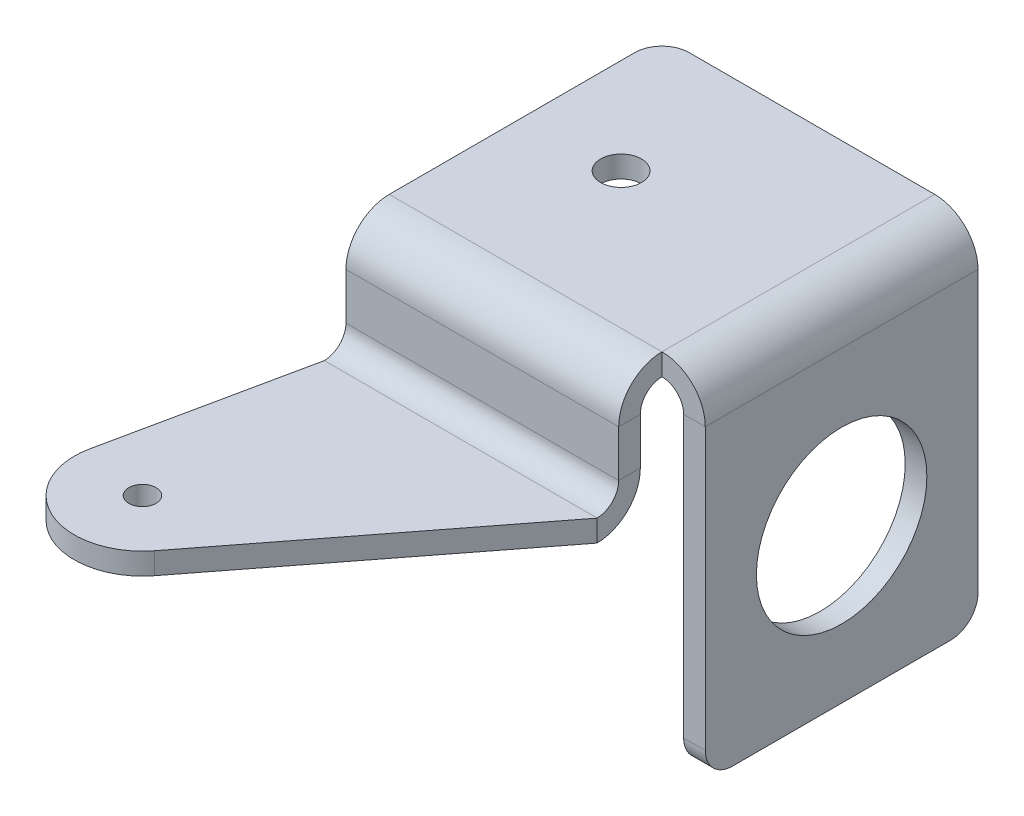
ISO-10303-21;
HEADER;
FILE_DESCRIPTION(('STEP AP214'),'2;1');
FILE_NAME('part.step','',(''),(''),'','','');
FILE_SCHEMA(('AUTOMOTIVE_DESIGN { 1 0 10303 214 1 1 1 1 }'));
ENDSEC;
DATA;
#1=APPLICATION_CONTEXT('core data for automotive mechanical design processes');
#2=APPLICATION_PROTOCOL_DEFINITION('international standard','automotive_design',2000,#1);
#3=PRODUCT_CONTEXT('',#1,'mechanical');
#4=PRODUCT('Part','Part','',(#3));
#5=PRODUCT_RELATED_PRODUCT_CATEGORY('part','',(#4));
#6=PRODUCT_DEFINITION_FORMATION('','',#4);
#7=PRODUCT_DEFINITION_CONTEXT('part definition',#1,'design');
#8=PRODUCT_DEFINITION('design','',#6,#7);
#9=PRODUCT_DEFINITION_SHAPE('','',#8);
#10=(LENGTH_UNIT() NAMED_UNIT(*) SI_UNIT(.MILLI.,.METRE.));
#11=(NAMED_UNIT(*) PLANE_ANGLE_UNIT() SI_UNIT($,.RADIAN.));
#12=(NAMED_UNIT(*) SI_UNIT($,.STERADIAN.) SOLID_ANGLE_UNIT());
#13=UNCERTAINTY_MEASURE_WITH_UNIT(LENGTH_MEASURE(1.E-05),#10,'distance_accuracy_value','');
#14=(GEOMETRIC_REPRESENTATION_CONTEXT(3) GLOBAL_UNCERTAINTY_ASSIGNED_CONTEXT((#13)) GLOBAL_UNIT_ASSIGNED_CONTEXT((#10,
#11,#12)) REPRESENTATION_CONTEXT('',''));
#15=CARTESIAN_POINT('',(0.,0.,0.));
#16=DIRECTION('',(0.,0.,1.));
#17=DIRECTION('',(1.,0.,0.));
#18=AXIS2_PLACEMENT_3D('',#15,#16,#17);
#19=CARTESIAN_POINT('',(40.,1.27,0.));
#20=DIRECTION('',(1.,0.,0.));
#21=DIRECTION('',(0.,0.,-1.));
#22=AXIS2_PLACEMENT_3D('',#19,#20,#21);
#23=PLANE('',#22);
#24=DIRECTION('',(0.,0.,-1.));
#25=VECTOR('',#24,1.);
#26=CARTESIAN_POINT('',(40.,-0.3175,0.));
#27=LINE('',#26,#25);
#28=CARTESIAN_POINT('',(40.,-0.317499999999995,0.));
#29=VERTEX_POINT('',#28);
#30=CARTESIAN_POINT('',(40.,-0.3175,-18.));
#31=VERTEX_POINT('',#30);
#32=EDGE_CURVE('E370',#29,#31,#27,.T.);
#33=ORIENTED_EDGE('',*,*,#32,.F.);
#34=DIRECTION('',(0.,1.,0.));
#35=VECTOR('',#34,1.);
#36=CARTESIAN_POINT('',(40.,1.27,0.));
#37=LINE('',#36,#35);
#38=CARTESIAN_POINT('',(40.,1.27,0.));
#39=VERTEX_POINT('',#38);
#40=EDGE_CURVE('E378',#29,#39,#37,.T.);
#41=ORIENTED_EDGE('',*,*,#40,.T.);
#42=DIRECTION('',(0.,0.,-1.));
#43=VECTOR('',#42,1.);
#44=CARTESIAN_POINT('',(40.,1.27,0.));
#45=LINE('',#44,#43);
#46=CARTESIAN_POINT('',(40.,1.27,-18.));
#47=VERTEX_POINT('',#46);
#48=EDGE_CURVE('E355',#39,#47,#45,.T.);
#49=ORIENTED_EDGE('',*,*,#48,.T.);
#50=DIRECTION('',(0.,-1.,0.));
#51=VECTOR('',#50,1.);
#52=CARTESIAN_POINT('',(40.,1.27,-18.));
#53=LINE('',#52,#51);
#54=EDGE_CURVE('E381',#31,#47,#53,.F.);
#55=ORIENTED_EDGE('',*,*,#54,.F.);
#56=EDGE_LOOP('',(#33,#41,#49,#55));
#57=FACE_BOUND('',#56,.T.);
#58=ADVANCED_FACE('F47',(#57),#23,.F.);
#59=CARTESIAN_POINT('',(60.,1.27,-20.));
#60=DIRECTION('',(0.,0.,1.));
#61=DIRECTION('',(1.,0.,0.));
#62=AXIS2_PLACEMENT_3D('',#59,#60,#61);
#63=PLANE('',#62);
#64=DIRECTION('',(1.,0.,0.));
#65=VECTOR('',#64,1.);
#66=CARTESIAN_POINT('',(60.,1.27,-20.));
#67=LINE('',#66,#65);
#68=CARTESIAN_POINT('',(42.,1.27,-20.));
#69=VERTEX_POINT('',#68);
#70=CARTESIAN_POINT('',(60.,1.27,-20.));
#71=VERTEX_POINT('',#70);
#72=EDGE_CURVE('E358',#69,#71,#67,.T.);
#73=ORIENTED_EDGE('',*,*,#72,.T.);
#74=DIRECTION('',(0.,1.,0.));
#75=VECTOR('',#74,1.);
#76=CARTESIAN_POINT('',(60.,1.27,-20.));
#77=LINE('',#76,#75);
#78=CARTESIAN_POINT('',(60.,-0.317499999999999,-20.));
#79=VERTEX_POINT('',#78);
#80=EDGE_CURVE('E375',#79,#71,#77,.T.);
#81=ORIENTED_EDGE('',*,*,#80,.F.);
#82=DIRECTION('',(-1.,0.,0.));
#83=VECTOR('',#82,1.);
#84=CARTESIAN_POINT('',(60.,-0.3175,-20.));
#85=LINE('',#84,#83);
#86=CARTESIAN_POINT('',(42.,-0.3175,-20.));
#87=VERTEX_POINT('',#86);
#88=EDGE_CURVE('E349',#87,#79,#85,.F.);
#89=ORIENTED_EDGE('',*,*,#88,.F.);
#90=DIRECTION('',(0.,-1.,0.));
#91=VECTOR('',#90,1.);
#92=CARTESIAN_POINT('',(42.,1.27,-20.));
#93=LINE('',#92,#91);
#94=EDGE_CURVE('E388',#69,#87,#93,.T.);
#95=ORIENTED_EDGE('',*,*,#94,.F.);
#96=EDGE_LOOP('',(#73,#81,#89,#95));
#97=FACE_BOUND('',#96,.T.);
#98=ADVANCED_FACE('F439',(#97),#63,.F.);
#99=CARTESIAN_POINT('',(47.,1.27,-10.));
#100=DIRECTION('',(0.,-1.,0.));
#101=DIRECTION('',(0.,0.,-1.));
#102=AXIS2_PLACEMENT_3D('',#99,#100,#101);
#103=CYLINDRICAL_SURFACE('',#102,1.5);
#104=CARTESIAN_POINT('',(47.,1.27,-10.));
#105=DIRECTION('',(0.,-1.,0.));
#106=DIRECTION('',(0.,0.,1.));
#107=AXIS2_PLACEMENT_3D('',#104,#105,#106);
#108=CIRCLE('',#107,1.5);
#109=CARTESIAN_POINT('',(47.,1.27,-8.5));
#110=VERTEX_POINT('',#109);
#111=EDGE_CURVE('E345',#110,#110,#108,.T.);
#112=ORIENTED_EDGE('',*,*,#111,.F.);
#113=EDGE_LOOP('',(#112));
#114=FACE_BOUND('',#113,.T.);
#115=CARTESIAN_POINT('',(47.,-0.3175,-10.));
#116=DIRECTION('',(0.,-1.,0.));
#117=DIRECTION('',(0.,0.,1.));
#118=AXIS2_PLACEMENT_3D('',#115,#116,#117);
#119=CIRCLE('',#118,1.5);
#120=CARTESIAN_POINT('',(47.,-0.3175,-8.5));
#121=VERTEX_POINT('',#120);
#122=EDGE_CURVE('E338',#121,#121,#119,.T.);
#123=ORIENTED_EDGE('',*,*,#122,.T.);
#124=EDGE_LOOP('',(#123));
#125=FACE_BOUND('',#124,.T.);
#126=ADVANCED_FACE('F445',(#114,#125),#103,.F.);
#127=CARTESIAN_POINT('',(60.,1.27,0.));
#128=DIRECTION('',(0.,-1.,0.));
#129=DIRECTION('',(0.,0.,-1.));
#130=AXIS2_PLACEMENT_3D('',#127,#128,#129);
#131=PLANE('',#130);
#132=ORIENTED_EDGE('',*,*,#111,.T.);
#133=EDGE_LOOP('',(#132));
#134=FACE_BOUND('',#133,.T.);
#135=ORIENTED_EDGE('',*,*,#48,.F.);
#136=DIRECTION('',(-1.,0.,0.));
#137=VECTOR('',#136,1.);
#138=CARTESIAN_POINT('',(60.,1.27,0.));
#139=LINE('',#138,#137);
#140=CARTESIAN_POINT('',(60.,1.27000000000001,0.));
#141=VERTEX_POINT('',#140);
#142=EDGE_CURVE('E352',#141,#39,#139,.T.);
#143=ORIENTED_EDGE('',*,*,#142,.F.);
#144=DIRECTION('',(0.,0.,1.));
#145=VECTOR('',#144,1.);
#146=CARTESIAN_POINT('',(60.,1.27,0.));
#147=LINE('',#146,#145);
#148=EDGE_CURVE('E348',#71,#141,#147,.T.);
#149=ORIENTED_EDGE('',*,*,#148,.F.);
#150=ORIENTED_EDGE('',*,*,#72,.F.);
#151=CARTESIAN_POINT('',(42.,1.27,-18.));
#152=DIRECTION('',(0.,1.,0.));
#153=DIRECTION('',(0.,0.,-1.));
#154=AXIS2_PLACEMENT_3D('',#151,#152,#153);
#155=CIRCLE('',#154,2.);
#156=EDGE_CURVE('E386',#47,#69,#155,.F.);
#157=ORIENTED_EDGE('',*,*,#156,.F.);
#158=EDGE_LOOP('',(#135,#143,#149,#150,#157));
#159=FACE_BOUND('',#158,.T.);
#160=ADVANCED_FACE('F477',(#134,#159),#131,.F.);
#161=CARTESIAN_POINT('',(60.,-0.3175,0.));
#162=DIRECTION('',(0.,-1.,0.));
#163=DIRECTION('',(0.,0.,-1.));
#164=AXIS2_PLACEMENT_3D('',#161,#162,#163);
#165=PLANE('',#164);
#166=ORIENTED_EDGE('',*,*,#122,.F.);
#167=EDGE_LOOP('',(#166));
#168=FACE_BOUND('',#167,.T.);
#169=ORIENTED_EDGE('',*,*,#88,.T.);
#170=DIRECTION('',(0.,0.,-1.));
#171=VECTOR('',#170,1.);
#172=CARTESIAN_POINT('',(60.,-0.3175,0.));
#173=LINE('',#172,#171);
#174=CARTESIAN_POINT('',(60.,-0.317499999999995,0.));
#175=VERTEX_POINT('',#174);
#176=EDGE_CURVE('E364',#79,#175,#173,.F.);
#177=ORIENTED_EDGE('',*,*,#176,.T.);
#178=DIRECTION('',(-1.,0.,0.));
#179=VECTOR('',#178,1.);
#180=CARTESIAN_POINT('',(60.,-0.3175,0.));
#181=LINE('',#180,#179);
#182=EDGE_CURVE('E367',#175,#29,#181,.T.);
#183=ORIENTED_EDGE('',*,*,#182,.T.);
#184=ORIENTED_EDGE('',*,*,#32,.T.);
#185=CARTESIAN_POINT('',(42.,-0.3175,-18.));
#186=DIRECTION('',(0.,1.,0.));
#187=DIRECTION('',(0.,0.,-1.));
#188=AXIS2_PLACEMENT_3D('',#185,#186,#187);
#189=CIRCLE('',#188,2.);
#190=EDGE_CURVE('E391',#87,#31,#189,.T.);
#191=ORIENTED_EDGE('',*,*,#190,.F.);
#192=EDGE_LOOP('',(#169,#177,#183,#184,#191));
#193=FACE_BOUND('',#192,.T.);
#194=ADVANCED_FACE('F463',(#168,#193),#165,.T.);
#195=CARTESIAN_POINT('',(60.,-1.905,0.));
#196=DIRECTION('',(0.,0.,1.));
#197=DIRECTION('',(-1.,0.,0.));
#198=AXIS2_PLACEMENT_3D('',#195,#196,#197);
#199=PLANE('',#198);
#200=DIRECTION('',(-1.,0.,0.));
#201=VECTOR('',#200,1.);
#202=CARTESIAN_POINT('',(63.175,-1.90499999999999,0.));
#203=LINE('',#202,#201);
#204=CARTESIAN_POINT('',(61.5875,-1.90499999999999,0.));
#205=VERTEX_POINT('',#204);
#206=CARTESIAN_POINT('',(63.175,-1.90499999999999,0.));
#207=VERTEX_POINT('',#206);
#208=EDGE_CURVE('E306',#205,#207,#203,.F.);
#209=ORIENTED_EDGE('',*,*,#208,.T.);
#210=CARTESIAN_POINT('',(60.,-1.905,0.));
#211=DIRECTION('',(0.,0.,1.));
#212=DIRECTION('',(1.,0.,0.));
#213=AXIS2_PLACEMENT_3D('',#210,#211,#212);
#214=CIRCLE('',#213,3.175);
#215=EDGE_CURVE('E335',#141,#207,#214,.F.);
#216=ORIENTED_EDGE('',*,*,#215,.F.);
#217=DIRECTION('',(0.,1.,0.));
#218=VECTOR('',#217,1.);
#219=CARTESIAN_POINT('',(60.,1.27,0.));
#220=LINE('',#219,#218);
#221=EDGE_CURVE('E361',#175,#141,#220,.T.);
#222=ORIENTED_EDGE('',*,*,#221,.F.);
#223=CARTESIAN_POINT('',(60.,-1.905,0.));
#224=DIRECTION('',(0.,0.,1.));
#225=DIRECTION('',(1.,0.,0.));
#226=AXIS2_PLACEMENT_3D('',#223,#224,#225);
#227=CIRCLE('',#226,1.5875);
#228=EDGE_CURVE('E341',#175,#205,#227,.F.);
#229=ORIENTED_EDGE('',*,*,#228,.T.);
#230=EDGE_LOOP('',(#209,#216,#222,#229));
#231=FACE_BOUND('',#230,.T.);
#232=ADVANCED_FACE('F428',(#231),#199,.T.);
#233=CARTESIAN_POINT('',(60.,-1.905,-20.));
#234=DIRECTION('',(0.,0.,1.));
#235=DIRECTION('',(-1.,0.,0.));
#236=AXIS2_PLACEMENT_3D('',#233,#234,#235);
#237=PLANE('',#236);
#238=CARTESIAN_POINT('',(60.,-1.905,-20.));
#239=DIRECTION('',(0.,0.,1.));
#240=DIRECTION('',(1.,0.,0.));
#241=AXIS2_PLACEMENT_3D('',#238,#239,#240);
#242=CIRCLE('',#241,1.5875);
#243=CARTESIAN_POINT('',(61.5875,-1.90499999999999,-20.));
#244=VERTEX_POINT('',#243);
#245=EDGE_CURVE('E309',#244,#79,#242,.T.);
#246=ORIENTED_EDGE('',*,*,#245,.T.);
#247=ORIENTED_EDGE('',*,*,#80,.T.);
#248=CARTESIAN_POINT('',(60.,-1.905,-20.));
#249=DIRECTION('',(0.,0.,1.));
#250=DIRECTION('',(1.,0.,0.));
#251=AXIS2_PLACEMENT_3D('',#248,#249,#250);
#252=CIRCLE('',#251,3.175);
#253=CARTESIAN_POINT('',(63.175,-1.90499999999999,-20.));
#254=VERTEX_POINT('',#253);
#255=EDGE_CURVE('E339',#254,#71,#252,.T.);
#256=ORIENTED_EDGE('',*,*,#255,.F.);
#257=DIRECTION('',(-1.,0.,0.));
#258=VECTOR('',#257,1.);
#259=CARTESIAN_POINT('',(61.5875,-1.90499999999999,-20.));
#260=LINE('',#259,#258);
#261=EDGE_CURVE('E327',#244,#254,#260,.F.);
#262=ORIENTED_EDGE('',*,*,#261,.F.);
#263=EDGE_LOOP('',(#246,#247,#256,#262));
#264=FACE_BOUND('',#263,.T.);
#265=ADVANCED_FACE('F481',(#264),#237,.F.);
#266=CARTESIAN_POINT('',(60.,-1.905,-20.));
#267=DIRECTION('',(0.,0.,-1.));
#268=DIRECTION('',(1.,0.,0.));
#269=AXIS2_PLACEMENT_3D('',#266,#267,#268);
#270=CYLINDRICAL_SURFACE('',#269,3.175);
#271=ORIENTED_EDGE('',*,*,#148,.T.);
#272=ORIENTED_EDGE('',*,*,#215,.T.);
#273=DIRECTION('',(0.,0.,-1.));
#274=VECTOR('',#273,1.);
#275=CARTESIAN_POINT('',(63.175,-1.90499999999999,0.));
#276=LINE('',#275,#274);
#277=EDGE_CURVE('E324',#254,#207,#276,.F.);
#278=ORIENTED_EDGE('',*,*,#277,.F.);
#279=ORIENTED_EDGE('',*,*,#255,.T.);
#280=EDGE_LOOP('',(#271,#272,#278,#279));
#281=FACE_BOUND('',#280,.T.);
#282=ADVANCED_FACE('F421',(#281),#270,.T.);
#283=CARTESIAN_POINT('',(60.,-1.905,-20.));
#284=DIRECTION('',(0.,0.,-1.));
#285=DIRECTION('',(1.,0.,0.));
#286=AXIS2_PLACEMENT_3D('',#283,#284,#285);
#287=CYLINDRICAL_SURFACE('',#286,1.5875);
#288=ORIENTED_EDGE('',*,*,#176,.F.);
#289=ORIENTED_EDGE('',*,*,#245,.F.);
#290=DIRECTION('',(0.,0.,-1.));
#291=VECTOR('',#290,1.);
#292=CARTESIAN_POINT('',(61.5875,-1.90499999999999,0.));
#293=LINE('',#292,#291);
#294=EDGE_CURVE('E330',#205,#244,#293,.T.);
#295=ORIENTED_EDGE('',*,*,#294,.F.);
#296=ORIENTED_EDGE('',*,*,#228,.F.);
#297=EDGE_LOOP('',(#288,#289,#295,#296));
#298=FACE_BOUND('',#297,.T.);
#299=ADVANCED_FACE('F485',(#298),#287,.F.);
#300=CARTESIAN_POINT('',(63.1750000000001,-24.455,-20.));
#301=DIRECTION('',(0.,0.,1.));
#302=DIRECTION('',(-1.,0.,0.));
#303=AXIS2_PLACEMENT_3D('',#300,#301,#302);
#304=PLANE('',#303);
#305=DIRECTION('',(0.,1.,0.));
#306=VECTOR('',#305,1.);
#307=CARTESIAN_POINT('',(61.5875000000001,-24.455,-20.));
#308=LINE('',#307,#306);
#309=CARTESIAN_POINT('',(61.5875000000001,-22.455,-20.));
#310=VERTEX_POINT('',#309);
#311=EDGE_CURVE('E321',#244,#310,#308,.F.);
#312=ORIENTED_EDGE('',*,*,#311,.F.);
#313=ORIENTED_EDGE('',*,*,#261,.T.);
#314=DIRECTION('',(0.,-1.,0.));
#315=VECTOR('',#314,1.);
#316=CARTESIAN_POINT('',(63.175,0.,-20.));
#317=LINE('',#316,#315);
#318=CARTESIAN_POINT('',(63.1750000000001,-22.455,-20.));
#319=VERTEX_POINT('',#318);
#320=EDGE_CURVE('E313',#254,#319,#317,.T.);
#321=ORIENTED_EDGE('',*,*,#320,.T.);
#322=DIRECTION('',(-1.,0.,0.));
#323=VECTOR('',#322,1.);
#324=CARTESIAN_POINT('',(63.1750000000001,-22.455,-20.));
#325=LINE('',#324,#323);
#326=EDGE_CURVE('E402',#310,#319,#325,.F.);
#327=ORIENTED_EDGE('',*,*,#326,.F.);
#328=EDGE_LOOP('',(#312,#313,#321,#327));
#329=FACE_BOUND('',#328,.T.);
#330=ADVANCED_FACE('F416',(#329),#304,.F.);
#331=CARTESIAN_POINT('',(63.175,-0.317499999999994,0.));
#332=DIRECTION('',(0.,0.,-1.));
#333=DIRECTION('',(1.,0.,0.));
#334=AXIS2_PLACEMENT_3D('',#331,#332,#333);
#335=PLANE('',#334);
#336=DIRECTION('',(0.,1.,0.));
#337=VECTOR('',#336,1.);
#338=CARTESIAN_POINT('',(63.175,0.,0.));
#339=LINE('',#338,#337);
#340=CARTESIAN_POINT('',(63.1750000000001,-22.455,0.));
#341=VERTEX_POINT('',#340);
#342=EDGE_CURVE('E307',#341,#207,#339,.T.);
#343=ORIENTED_EDGE('',*,*,#342,.T.);
#344=ORIENTED_EDGE('',*,*,#208,.F.);
#345=DIRECTION('',(0.,-1.,0.));
#346=VECTOR('',#345,1.);
#347=CARTESIAN_POINT('',(61.5875,-0.3175,0.));
#348=LINE('',#347,#346);
#349=CARTESIAN_POINT('',(61.5875000000001,-22.455,0.));
#350=VERTEX_POINT('',#349);
#351=EDGE_CURVE('E316',#350,#205,#348,.F.);
#352=ORIENTED_EDGE('',*,*,#351,.F.);
#353=DIRECTION('',(-1.,0.,0.));
#354=VECTOR('',#353,1.);
#355=CARTESIAN_POINT('',(63.1750000000001,-22.455,0.));
#356=LINE('',#355,#354);
#357=EDGE_CURVE('E11',#341,#350,#356,.T.);
#358=ORIENTED_EDGE('',*,*,#357,.F.);
#359=EDGE_LOOP('',(#343,#344,#352,#358));
#360=FACE_BOUND('',#359,.T.);
#361=ADVANCED_FACE('F432',(#360),#335,.F.);
#362=CARTESIAN_POINT('',(63.175,0.,0.));
#363=DIRECTION('',(-1.,0.,0.));
#364=DIRECTION('',(0.,1.,0.));
#365=AXIS2_PLACEMENT_3D('',#362,#363,#364);
#366=PLANE('',#365);
#367=CARTESIAN_POINT('',(63.175,-13.18,-10.));
#368=DIRECTION('',(1.,0.,0.));
#369=DIRECTION('',(0.,1.,0.));
#370=AXIS2_PLACEMENT_3D('',#367,#368,#369);
#371=CIRCLE('',#370,6.25);
#372=CARTESIAN_POINT('',(63.175,-6.92999999999999,-10.));
#373=VERTEX_POINT('',#372);
#374=EDGE_CURVE('E303',#373,#373,#371,.F.);
#375=ORIENTED_EDGE('',*,*,#374,.T.);
#376=EDGE_LOOP('',(#375));
#377=FACE_BOUND('',#376,.T.);
#378=ORIENTED_EDGE('',*,*,#320,.F.);
#379=ORIENTED_EDGE('',*,*,#277,.T.);
#380=ORIENTED_EDGE('',*,*,#342,.F.);
#381=CARTESIAN_POINT('',(63.1750000000001,-22.455,-2.));
#382=DIRECTION('',(1.,0.,0.));
#383=DIRECTION('',(0.,1.,0.));
#384=AXIS2_PLACEMENT_3D('',#381,#382,#383);
#385=CIRCLE('',#384,2.);
#386=CARTESIAN_POINT('',(63.1750000000001,-24.455,-2.));
#387=VERTEX_POINT('',#386);
#388=EDGE_CURVE('E61',#387,#341,#385,.F.);
#389=ORIENTED_EDGE('',*,*,#388,.F.);
#390=DIRECTION('',(0.,0.,1.));
#391=VECTOR('',#390,1.);
#392=CARTESIAN_POINT('',(63.1750000000001,-24.455,0.));
#393=LINE('',#392,#391);
#394=CARTESIAN_POINT('',(63.1750000000001,-24.455,-18.));
#395=VERTEX_POINT('',#394);
#396=EDGE_CURVE('E310',#395,#387,#393,.T.);
#397=ORIENTED_EDGE('',*,*,#396,.F.);
#398=CARTESIAN_POINT('',(63.1750000000001,-22.455,-18.));
#399=DIRECTION('',(1.,0.,0.));
#400=DIRECTION('',(0.,1.,0.));
#401=AXIS2_PLACEMENT_3D('',#398,#399,#400);
#402=CIRCLE('',#401,2.);
#403=EDGE_CURVE('E55',#319,#395,#402,.F.);
#404=ORIENTED_EDGE('',*,*,#403,.F.);
#405=EDGE_LOOP('',(#378,#379,#380,#389,#397,#404));
#406=FACE_BOUND('',#405,.T.);
#407=ADVANCED_FACE('F408',(#377,#406),#366,.F.);
#408=CARTESIAN_POINT('',(61.5875,0.,0.));
#409=DIRECTION('',(-1.,0.,0.));
#410=DIRECTION('',(0.,1.,0.));
#411=AXIS2_PLACEMENT_3D('',#408,#409,#410);
#412=PLANE('',#411);
#413=CARTESIAN_POINT('',(61.5875,-13.18,-10.));
#414=DIRECTION('',(1.,0.,0.));
#415=DIRECTION('',(0.,1.,0.));
#416=AXIS2_PLACEMENT_3D('',#413,#414,#415);
#417=CIRCLE('',#416,6.25);
#418=CARTESIAN_POINT('',(61.5875,-6.93,-10.));
#419=VERTEX_POINT('',#418);
#420=EDGE_CURVE('E294',#419,#419,#417,.T.);
#421=ORIENTED_EDGE('',*,*,#420,.T.);
#422=EDGE_LOOP('',(#421));
#423=FACE_BOUND('',#422,.T.);
#424=DIRECTION('',(0.,0.,-1.));
#425=VECTOR('',#424,1.);
#426=CARTESIAN_POINT('',(61.5875000000001,-24.455,0.));
#427=LINE('',#426,#425);
#428=CARTESIAN_POINT('',(61.5875000000001,-24.455,-18.));
#429=VERTEX_POINT('',#428);
#430=CARTESIAN_POINT('',(61.5875000000001,-24.455,-2.));
#431=VERTEX_POINT('',#430);
#432=EDGE_CURVE('E318',#429,#431,#427,.F.);
#433=ORIENTED_EDGE('',*,*,#432,.T.);
#434=CARTESIAN_POINT('',(61.5875000000001,-22.455,-2.));
#435=DIRECTION('',(1.,0.,0.));
#436=DIRECTION('',(0.,1.,0.));
#437=AXIS2_PLACEMENT_3D('',#434,#435,#436);
#438=CIRCLE('',#437,2.);
#439=EDGE_CURVE('E397',#350,#431,#438,.T.);
#440=ORIENTED_EDGE('',*,*,#439,.F.);
#441=ORIENTED_EDGE('',*,*,#351,.T.);
#442=ORIENTED_EDGE('',*,*,#294,.T.);
#443=ORIENTED_EDGE('',*,*,#311,.T.);
#444=CARTESIAN_POINT('',(61.5875000000001,-22.455,-18.));
#445=DIRECTION('',(1.,0.,0.));
#446=DIRECTION('',(0.,1.,0.));
#447=AXIS2_PLACEMENT_3D('',#444,#445,#446);
#448=CIRCLE('',#447,2.);
#449=EDGE_CURVE('E400',#429,#310,#448,.T.);
#450=ORIENTED_EDGE('',*,*,#449,.F.);
#451=EDGE_LOOP('',(#433,#440,#441,#442,#443,#450));
#452=FACE_BOUND('',#451,.T.);
#453=ADVANCED_FACE('F414',(#423,#452),#412,.T.);
#454=CARTESIAN_POINT('',(63.1750000000001,-24.455,0.));
#455=DIRECTION('',(0.,1.,0.));
#456=DIRECTION('',(1.,0.,0.));
#457=AXIS2_PLACEMENT_3D('',#454,#455,#456);
#458=PLANE('',#457);
#459=ORIENTED_EDGE('',*,*,#396,.T.);
#460=DIRECTION('',(-1.,0.,0.));
#461=VECTOR('',#460,1.);
#462=CARTESIAN_POINT('',(63.1750000000001,-24.455,-2.));
#463=LINE('',#462,#461);
#464=EDGE_CURVE('E393',#431,#387,#463,.F.);
#465=ORIENTED_EDGE('',*,*,#464,.F.);
#466=ORIENTED_EDGE('',*,*,#432,.F.);
#467=DIRECTION('',(-1.,0.,0.));
#468=VECTOR('',#467,1.);
#469=CARTESIAN_POINT('',(63.1750000000001,-24.455,-18.));
#470=LINE('',#469,#468);
#471=EDGE_CURVE('E395',#395,#429,#470,.T.);
#472=ORIENTED_EDGE('',*,*,#471,.F.);
#473=EDGE_LOOP('',(#459,#465,#466,#472));
#474=FACE_BOUND('',#473,.T.);
#475=ADVANCED_FACE('F411',(#474),#458,.F.);
#476=CARTESIAN_POINT('',(63.1760000000001,-13.18,-10.));
#477=DIRECTION('',(-1.,0.,0.));
#478=DIRECTION('',(0.,1.,0.));
#479=AXIS2_PLACEMENT_3D('',#476,#477,#478);
#480=CYLINDRICAL_SURFACE('',#479,6.25);
#481=ORIENTED_EDGE('',*,*,#420,.F.);
#482=EDGE_LOOP('',(#481));
#483=FACE_BOUND('',#482,.T.);
#484=ORIENTED_EDGE('',*,*,#374,.F.);
#485=EDGE_LOOP('',(#484));
#486=FACE_BOUND('',#485,.T.);
#487=ADVANCED_FACE('F582',(#483,#486),#480,.F.);
#488=CARTESIAN_POINT('',(40.,-1.90499999999999,0.));
#489=DIRECTION('',(-1.,0.,0.));
#490=DIRECTION('',(0.,0.,-1.));
#491=AXIS2_PLACEMENT_3D('',#488,#489,#490);
#492=PLANE('',#491);
#493=DIRECTION('',(0.,0.,-1.));
#494=VECTOR('',#493,1.);
#495=CARTESIAN_POINT('',(40.,-1.90499999999999,3.17499999999999));
#496=LINE('',#495,#494);
#497=CARTESIAN_POINT('',(40.,-1.90499999999999,1.5875));
#498=VERTEX_POINT('',#497);
#499=CARTESIAN_POINT('',(40.,-1.90499999999998,3.175));
#500=VERTEX_POINT('',#499);
#501=EDGE_CURVE('E250',#498,#500,#496,.F.);
#502=ORIENTED_EDGE('',*,*,#501,.T.);
#503=CARTESIAN_POINT('',(40.,-1.90499999999999,0.));
#504=DIRECTION('',(-1.,0.,0.));
#505=DIRECTION('',(0.,0.,1.));
#506=AXIS2_PLACEMENT_3D('',#503,#504,#505);
#507=CIRCLE('',#506,3.175);
#508=EDGE_CURVE('E291',#39,#500,#507,.F.);
#509=ORIENTED_EDGE('',*,*,#508,.F.);
#510=ORIENTED_EDGE('',*,*,#40,.F.);
#511=CARTESIAN_POINT('',(40.,-1.90499999999999,0.));
#512=DIRECTION('',(-1.,0.,0.));
#513=DIRECTION('',(0.,0.,1.));
#514=AXIS2_PLACEMENT_3D('',#511,#512,#513);
#515=CIRCLE('',#514,1.5875);
#516=EDGE_CURVE('E297',#29,#498,#515,.F.);
#517=ORIENTED_EDGE('',*,*,#516,.T.);
#518=EDGE_LOOP('',(#502,#509,#510,#517));
#519=FACE_BOUND('',#518,.T.);
#520=ADVANCED_FACE('F470',(#519),#492,.T.);
#521=CARTESIAN_POINT('',(60.,-1.90499999999999,0.));
#522=DIRECTION('',(-1.,0.,0.));
#523=DIRECTION('',(0.,0.,-1.));
#524=AXIS2_PLACEMENT_3D('',#521,#522,#523);
#525=PLANE('',#524);
#526=CARTESIAN_POINT('',(60.,-1.90499999999999,0.));
#527=DIRECTION('',(-1.,0.,0.));
#528=DIRECTION('',(0.,0.,1.));
#529=AXIS2_PLACEMENT_3D('',#526,#527,#528);
#530=CIRCLE('',#529,1.5875);
#531=CARTESIAN_POINT('',(60.,-1.90499999999999,1.5875));
#532=VERTEX_POINT('',#531);
#533=EDGE_CURVE('E260',#532,#175,#530,.T.);
#534=ORIENTED_EDGE('',*,*,#533,.T.);
#535=ORIENTED_EDGE('',*,*,#221,.T.);
#536=CARTESIAN_POINT('',(60.,-1.90499999999999,0.));
#537=DIRECTION('',(-1.,0.,0.));
#538=DIRECTION('',(0.,0.,1.));
#539=AXIS2_PLACEMENT_3D('',#536,#537,#538);
#540=CIRCLE('',#539,3.175);
#541=CARTESIAN_POINT('',(60.,-1.90499999999999,3.175));
#542=VERTEX_POINT('',#541);
#543=EDGE_CURVE('E295',#542,#141,#540,.T.);
#544=ORIENTED_EDGE('',*,*,#543,.F.);
#545=DIRECTION('',(0.,0.,-1.));
#546=VECTOR('',#545,1.);
#547=CARTESIAN_POINT('',(60.,-1.90499999999999,1.5875));
#548=LINE('',#547,#546);
#549=EDGE_CURVE('E283',#532,#542,#548,.F.);
#550=ORIENTED_EDGE('',*,*,#549,.F.);
#551=EDGE_LOOP('',(#534,#535,#544,#550));
#552=FACE_BOUND('',#551,.T.);
#553=ADVANCED_FACE('F487',(#552),#525,.F.);
#554=CARTESIAN_POINT('',(60.,-1.90499999999999,0.));
#555=DIRECTION('',(1.,0.,0.));
#556=DIRECTION('',(0.,0.,1.));
#557=AXIS2_PLACEMENT_3D('',#554,#555,#556);
#558=CYLINDRICAL_SURFACE('',#557,3.175);
#559=ORIENTED_EDGE('',*,*,#142,.T.);
#560=ORIENTED_EDGE('',*,*,#508,.T.);
#561=DIRECTION('',(1.,0.,0.));
#562=VECTOR('',#561,1.);
#563=CARTESIAN_POINT('',(40.,-1.90499999999999,3.175));
#564=LINE('',#563,#562);
#565=EDGE_CURVE('E280',#542,#500,#564,.F.);
#566=ORIENTED_EDGE('',*,*,#565,.F.);
#567=ORIENTED_EDGE('',*,*,#543,.T.);
#568=EDGE_LOOP('',(#559,#560,#566,#567));
#569=FACE_BOUND('',#568,.T.);
#570=ADVANCED_FACE('F474',(#569),#558,.T.);
#571=CARTESIAN_POINT('',(60.,-1.90499999999999,0.));
#572=DIRECTION('',(1.,0.,0.));
#573=DIRECTION('',(0.,0.,1.));
#574=AXIS2_PLACEMENT_3D('',#571,#572,#573);
#575=CYLINDRICAL_SURFACE('',#574,1.5875);
#576=ORIENTED_EDGE('',*,*,#182,.F.);
#577=ORIENTED_EDGE('',*,*,#533,.F.);
#578=DIRECTION('',(1.,0.,0.));
#579=VECTOR('',#578,1.);
#580=CARTESIAN_POINT('',(40.,-1.90499999999999,1.5875));
#581=LINE('',#580,#579);
#582=EDGE_CURVE('E286',#498,#532,#581,.T.);
#583=ORIENTED_EDGE('',*,*,#582,.F.);
#584=ORIENTED_EDGE('',*,*,#516,.F.);
#585=EDGE_LOOP('',(#576,#577,#583,#584));
#586=FACE_BOUND('',#585,.T.);
#587=ADVANCED_FACE('F490',(#586),#575,.F.);
#588=CARTESIAN_POINT('',(60.,-5.31749999999999,3.17500000000001));
#589=DIRECTION('',(-1.,0.,0.));
#590=DIRECTION('',(0.,1.,0.));
#591=AXIS2_PLACEMENT_3D('',#588,#589,#590);
#592=PLANE('',#591);
#593=ORIENTED_EDGE('',*,*,#549,.T.);
#594=DIRECTION('',(0.,-1.,0.));
#595=VECTOR('',#594,1.);
#596=CARTESIAN_POINT('',(60.,0.,3.17499999999999));
#597=LINE('',#596,#595);
#598=CARTESIAN_POINT('',(60.,-5.31749999999999,3.17500000000001));
#599=VERTEX_POINT('',#598);
#600=EDGE_CURVE('E269',#542,#599,#597,.T.);
#601=ORIENTED_EDGE('',*,*,#600,.T.);
#602=DIRECTION('',(0.,0.,-1.));
#603=VECTOR('',#602,1.);
#604=CARTESIAN_POINT('',(60.,-5.31749999999999,3.17500000000001));
#605=LINE('',#604,#603);
#606=CARTESIAN_POINT('',(60.,-5.3175,1.58750000000001));
#607=VERTEX_POINT('',#606);
#608=EDGE_CURVE('E257',#599,#607,#605,.T.);
#609=ORIENTED_EDGE('',*,*,#608,.T.);
#610=DIRECTION('',(0.,1.,0.));
#611=VECTOR('',#610,1.);
#612=CARTESIAN_POINT('',(60.,-5.3175,1.58750000000001));
#613=LINE('',#612,#611);
#614=EDGE_CURVE('E277',#532,#607,#613,.F.);
#615=ORIENTED_EDGE('',*,*,#614,.F.);
#616=EDGE_LOOP('',(#593,#601,#609,#615));
#617=FACE_BOUND('',#616,.T.);
#618=ADVANCED_FACE('F503',(#617),#592,.F.);
#619=CARTESIAN_POINT('',(40.,-0.317499999999994,3.17499999999999));
#620=DIRECTION('',(1.,0.,0.));
#621=DIRECTION('',(0.,0.,1.));
#622=AXIS2_PLACEMENT_3D('',#619,#620,#621);
#623=PLANE('',#622);
#624=ORIENTED_EDGE('',*,*,#501,.F.);
#625=DIRECTION('',(0.,-1.,0.));
#626=VECTOR('',#625,1.);
#627=CARTESIAN_POINT('',(40.,-0.3175,1.58749999999999));
#628=LINE('',#627,#626);
#629=CARTESIAN_POINT('',(40.,-5.3175,1.58750000000001));
#630=VERTEX_POINT('',#629);
#631=EDGE_CURVE('E272',#630,#498,#628,.F.);
#632=ORIENTED_EDGE('',*,*,#631,.F.);
#633=DIRECTION('',(0.,0.,-1.));
#634=VECTOR('',#633,1.);
#635=CARTESIAN_POINT('',(40.,-5.31749999999999,3.17500000000001));
#636=LINE('',#635,#634);
#637=CARTESIAN_POINT('',(40.,-5.31749999999999,3.17500000000001));
#638=VERTEX_POINT('',#637);
#639=EDGE_CURVE('E261',#638,#630,#636,.T.);
#640=ORIENTED_EDGE('',*,*,#639,.F.);
#641=DIRECTION('',(0.,1.,0.));
#642=VECTOR('',#641,1.);
#643=CARTESIAN_POINT('',(40.,0.,3.17499999999999));
#644=LINE('',#643,#642);
#645=EDGE_CURVE('E264',#638,#500,#644,.T.);
#646=ORIENTED_EDGE('',*,*,#645,.T.);
#647=EDGE_LOOP('',(#624,#632,#640,#646));
#648=FACE_BOUND('',#647,.T.);
#649=ADVANCED_FACE('F497',(#648),#623,.F.);
#650=CARTESIAN_POINT('',(60.,0.,3.17499999999999));
#651=DIRECTION('',(0.,0.,-1.));
#652=DIRECTION('',(0.,1.,0.));
#653=AXIS2_PLACEMENT_3D('',#650,#651,#652);
#654=PLANE('',#653);
#655=ORIENTED_EDGE('',*,*,#565,.T.);
#656=ORIENTED_EDGE('',*,*,#645,.F.);
#657=DIRECTION('',(-1.,0.,0.));
#658=VECTOR('',#657,1.);
#659=CARTESIAN_POINT('',(60.,-5.31749999999999,3.17500000000001));
#660=LINE('',#659,#658);
#661=EDGE_CURVE('E266',#599,#638,#660,.T.);
#662=ORIENTED_EDGE('',*,*,#661,.F.);
#663=ORIENTED_EDGE('',*,*,#600,.F.);
#664=EDGE_LOOP('',(#655,#656,#662,#663));
#665=FACE_BOUND('',#664,.T.);
#666=ADVANCED_FACE('F501',(#665),#654,.F.);
#667=CARTESIAN_POINT('',(60.,0.,1.58749999999999));
#668=DIRECTION('',(0.,0.,-1.));
#669=DIRECTION('',(0.,1.,0.));
#670=AXIS2_PLACEMENT_3D('',#667,#668,#669);
#671=PLANE('',#670);
#672=ORIENTED_EDGE('',*,*,#614,.T.);
#673=DIRECTION('',(1.,0.,0.));
#674=VECTOR('',#673,1.);
#675=CARTESIAN_POINT('',(40.,-5.3175,1.58750000000001));
#676=LINE('',#675,#674);
#677=EDGE_CURVE('E274',#607,#630,#676,.F.);
#678=ORIENTED_EDGE('',*,*,#677,.T.);
#679=ORIENTED_EDGE('',*,*,#631,.T.);
#680=ORIENTED_EDGE('',*,*,#582,.T.);
#681=EDGE_LOOP('',(#672,#678,#679,#680));
#682=FACE_BOUND('',#681,.T.);
#683=ADVANCED_FACE('F492',(#682),#671,.T.);
#684=CARTESIAN_POINT('',(60.,-5.31749999999999,4.76250000000001));
#685=DIRECTION('',(1.,0.,0.));
#686=DIRECTION('',(0.,0.,1.));
#687=AXIS2_PLACEMENT_3D('',#684,#685,#686);
#688=PLANE('',#687);
#689=DIRECTION('',(0.,1.,0.));
#690=VECTOR('',#689,1.);
#691=CARTESIAN_POINT('',(60.,-8.49249999999999,4.76250000000001));
#692=LINE('',#691,#690);
#693=CARTESIAN_POINT('',(60.,-6.90499999999999,4.76250000000001));
#694=VERTEX_POINT('',#693);
#695=CARTESIAN_POINT('',(60.,-8.49249999999999,4.76250000000001));
#696=VERTEX_POINT('',#695);
#697=EDGE_CURVE('E208',#694,#696,#692,.F.);
#698=ORIENTED_EDGE('',*,*,#697,.T.);
#699=CARTESIAN_POINT('',(60.,-5.31749999999999,4.76250000000001));
#700=DIRECTION('',(1.,0.,0.));
#701=DIRECTION('',(0.,0.,-1.));
#702=AXIS2_PLACEMENT_3D('',#699,#700,#701);
#703=CIRCLE('',#702,3.175);
#704=EDGE_CURVE('E247',#607,#696,#703,.F.);
#705=ORIENTED_EDGE('',*,*,#704,.F.);
#706=ORIENTED_EDGE('',*,*,#608,.F.);
#707=CARTESIAN_POINT('',(60.,-5.31749999999999,4.76250000000001));
#708=DIRECTION('',(1.,0.,0.));
#709=DIRECTION('',(0.,0.,-1.));
#710=AXIS2_PLACEMENT_3D('',#707,#708,#709);
#711=CIRCLE('',#710,1.5875);
#712=EDGE_CURVE('E253',#599,#694,#711,.F.);
#713=ORIENTED_EDGE('',*,*,#712,.T.);
#714=EDGE_LOOP('',(#698,#705,#706,#713));
#715=FACE_BOUND('',#714,.T.);
#716=ADVANCED_FACE('F506',(#715),#688,.T.);
#717=CARTESIAN_POINT('',(40.,-5.31749999999999,4.76250000000001));
#718=DIRECTION('',(1.,0.,0.));
#719=DIRECTION('',(0.,0.,1.));
#720=AXIS2_PLACEMENT_3D('',#717,#718,#719);
#721=PLANE('',#720);
#722=CARTESIAN_POINT('',(40.,-5.31749999999999,4.76250000000001));
#723=DIRECTION('',(1.,0.,0.));
#724=DIRECTION('',(0.,0.,-1.));
#725=AXIS2_PLACEMENT_3D('',#722,#723,#724);
#726=CIRCLE('',#725,1.5875);
#727=CARTESIAN_POINT('',(40.,-6.90499999999999,4.76250000000001));
#728=VERTEX_POINT('',#727);
#729=EDGE_CURVE('E225',#728,#638,#726,.T.);
#730=ORIENTED_EDGE('',*,*,#729,.T.);
#731=ORIENTED_EDGE('',*,*,#639,.T.);
#732=CARTESIAN_POINT('',(40.,-5.31749999999999,4.76250000000001));
#733=DIRECTION('',(1.,0.,0.));
#734=DIRECTION('',(0.,0.,-1.));
#735=AXIS2_PLACEMENT_3D('',#732,#733,#734);
#736=CIRCLE('',#735,3.175);
#737=CARTESIAN_POINT('',(40.,-8.49249999999999,4.76250000000001));
#738=VERTEX_POINT('',#737);
#739=EDGE_CURVE('E251',#738,#630,#736,.T.);
#740=ORIENTED_EDGE('',*,*,#739,.F.);
#741=DIRECTION('',(0.,1.,0.));
#742=VECTOR('',#741,1.);
#743=CARTESIAN_POINT('',(40.,-6.90499999999999,4.76250000000001));
#744=LINE('',#743,#742);
#745=EDGE_CURVE('E239',#728,#738,#744,.F.);
#746=ORIENTED_EDGE('',*,*,#745,.F.);
#747=EDGE_LOOP('',(#730,#731,#740,#746));
#748=FACE_BOUND('',#747,.T.);
#749=ADVANCED_FACE('F514',(#748),#721,.F.);
#750=CARTESIAN_POINT('',(40.,-5.31749999999999,4.76250000000001));
#751=DIRECTION('',(-1.,0.,0.));
#752=DIRECTION('',(0.,-1.,0.));
#753=AXIS2_PLACEMENT_3D('',#750,#751,#752);
#754=CYLINDRICAL_SURFACE('',#753,3.175);
#755=ORIENTED_EDGE('',*,*,#677,.F.);
#756=ORIENTED_EDGE('',*,*,#704,.T.);
#757=DIRECTION('',(-1.,0.,0.));
#758=VECTOR('',#757,1.);
#759=CARTESIAN_POINT('',(60.,-8.49249999999999,4.76250000000001));
#760=LINE('',#759,#758);
#761=EDGE_CURVE('E237',#738,#696,#760,.F.);
#762=ORIENTED_EDGE('',*,*,#761,.F.);
#763=ORIENTED_EDGE('',*,*,#739,.T.);
#764=EDGE_LOOP('',(#755,#756,#762,#763));
#765=FACE_BOUND('',#764,.T.);
#766=ADVANCED_FACE('F510',(#765),#754,.T.);
#767=CARTESIAN_POINT('',(40.,-5.31749999999999,4.76250000000001));
#768=DIRECTION('',(-1.,0.,0.));
#769=DIRECTION('',(0.,-1.,0.));
#770=AXIS2_PLACEMENT_3D('',#767,#768,#769);
#771=CYLINDRICAL_SURFACE('',#770,1.5875);
#772=ORIENTED_EDGE('',*,*,#661,.T.);
#773=ORIENTED_EDGE('',*,*,#729,.F.);
#774=DIRECTION('',(-1.,0.,0.));
#775=VECTOR('',#774,1.);
#776=CARTESIAN_POINT('',(60.,-6.90499999999999,4.76250000000001));
#777=LINE('',#776,#775);
#778=EDGE_CURVE('E242',#694,#728,#777,.T.);
#779=ORIENTED_EDGE('',*,*,#778,.F.);
#780=ORIENTED_EDGE('',*,*,#712,.F.);
#781=EDGE_LOOP('',(#772,#773,#779,#780));
#782=FACE_BOUND('',#781,.T.);
#783=ADVANCED_FACE('F518',(#782),#771,.F.);
#784=CARTESIAN_POINT('',(40.,-8.49249999999999,4.77500000000002));
#785=DIRECTION('',(1.,0.,0.));
#786=DIRECTION('',(0.,-1.,0.));
#787=AXIS2_PLACEMENT_3D('',#784,#785,#786);
#788=PLANE('',#787);
#789=ORIENTED_EDGE('',*,*,#745,.T.);
#790=DIRECTION('',(0.,0.,1.));
#791=VECTOR('',#790,1.);
#792=CARTESIAN_POINT('',(40.,-8.49249999999999,0.));
#793=LINE('',#792,#791);
#794=CARTESIAN_POINT('',(40.,-8.49249999999999,4.77500000000002));
#795=VERTEX_POINT('',#794);
#796=EDGE_CURVE('E229',#738,#795,#793,.T.);
#797=ORIENTED_EDGE('',*,*,#796,.T.);
#798=DIRECTION('',(0.,1.,0.));
#799=VECTOR('',#798,1.);
#800=CARTESIAN_POINT('',(40.,-8.49249999999999,4.77500000000002));
#801=LINE('',#800,#799);
#802=CARTESIAN_POINT('',(40.,-6.90499999999999,4.77500000000002));
#803=VERTEX_POINT('',#802);
#804=EDGE_CURVE('E222',#795,#803,#801,.T.);
#805=ORIENTED_EDGE('',*,*,#804,.T.);
#806=DIRECTION('',(0.,0.,-1.));
#807=VECTOR('',#806,1.);
#808=CARTESIAN_POINT('',(40.,-6.90499999999999,4.77500000000002));
#809=LINE('',#808,#807);
#810=EDGE_CURVE('E234',#728,#803,#809,.F.);
#811=ORIENTED_EDGE('',*,*,#810,.F.);
#812=EDGE_LOOP('',(#789,#797,#805,#811));
#813=FACE_BOUND('',#812,.T.);
#814=ADVANCED_FACE('F528',(#813),#788,.F.);
#815=CARTESIAN_POINT('',(60.,-8.49249999999999,3.17500000000002));
#816=DIRECTION('',(-1.,0.,0.));
#817=DIRECTION('',(0.,0.,-1.));
#818=AXIS2_PLACEMENT_3D('',#815,#816,#817);
#819=PLANE('',#818);
#820=ORIENTED_EDGE('',*,*,#697,.F.);
#821=DIRECTION('',(0.,0.,1.));
#822=VECTOR('',#821,1.);
#823=CARTESIAN_POINT('',(60.,-6.90499999999999,3.17500000000002));
#824=LINE('',#823,#822);
#825=CARTESIAN_POINT('',(60.,-6.90499999999999,4.77500000000002));
#826=VERTEX_POINT('',#825);
#827=EDGE_CURVE('E232',#826,#694,#824,.F.);
#828=ORIENTED_EDGE('',*,*,#827,.F.);
#829=DIRECTION('',(0.,1.,0.));
#830=VECTOR('',#829,1.);
#831=CARTESIAN_POINT('',(60.,-8.49249999999999,4.77500000000002));
#832=LINE('',#831,#830);
#833=CARTESIAN_POINT('',(60.,-8.49249999999999,4.77500000000002));
#834=VERTEX_POINT('',#833);
#835=EDGE_CURVE('E226',#834,#826,#832,.T.);
#836=ORIENTED_EDGE('',*,*,#835,.F.);
#837=DIRECTION('',(0.,0.,-1.));
#838=VECTOR('',#837,1.);
#839=CARTESIAN_POINT('',(60.,-8.49249999999999,0.));
#840=LINE('',#839,#838);
#841=EDGE_CURVE('E213',#834,#696,#840,.T.);
#842=ORIENTED_EDGE('',*,*,#841,.T.);
#843=EDGE_LOOP('',(#820,#828,#836,#842));
#844=FACE_BOUND('',#843,.T.);
#845=ADVANCED_FACE('F525',(#844),#819,.F.);
#846=CARTESIAN_POINT('',(60.,-8.49249999999999,0.));
#847=DIRECTION('',(0.,1.,0.));
#848=DIRECTION('',(1.,0.,0.));
#849=AXIS2_PLACEMENT_3D('',#846,#847,#848);
#850=PLANE('',#849);
#851=ORIENTED_EDGE('',*,*,#761,.T.);
#852=ORIENTED_EDGE('',*,*,#841,.F.);
#853=DIRECTION('',(0.611891462386182,0.,-0.790941741381058));
#854=VECTOR('',#853,1.);
#855=CARTESIAN_POINT('',(62.3109591317506,-8.49249999999999,1.78781329731376));
#856=LINE('',#855,#854);
#857=CARTESIAN_POINT('',(45.8547061835431,-8.49249999999999,23.0594573119309));
#858=VERTEX_POINT('',#857);
#859=EDGE_CURVE('E194',#858,#834,#856,.T.);
#860=ORIENTED_EDGE('',*,*,#859,.F.);
#861=CARTESIAN_POINT('',(41.8999974766378,-8.49249999999999,20.));
#862=DIRECTION('',(0.,-1.,0.));
#863=DIRECTION('',(1.,0.,0.));
#864=AXIS2_PLACEMENT_3D('',#861,#862,#863);
#865=CIRCLE('',#864,5.);
#866=CARTESIAN_POINT('',(37.0075504225043,-8.49249999999999,18.968514749257));
#867=VERTEX_POINT('',#866);
#868=EDGE_CURVE('E203',#867,#858,#865,.F.);
#869=ORIENTED_EDGE('',*,*,#868,.F.);
#870=DIRECTION('',(0.206297050148599,0.,-0.978489410826702));
#871=VECTOR('',#870,1.);
#872=CARTESIAN_POINT('',(41.8150484704888,-8.49249999999999,-3.83397287300622));
#873=LINE('',#872,#871);
#874=EDGE_CURVE('E200',#867,#795,#873,.T.);
#875=ORIENTED_EDGE('',*,*,#874,.T.);
#876=ORIENTED_EDGE('',*,*,#796,.F.);
#877=EDGE_LOOP('',(#851,#852,#860,#869,#875,#876));
#878=FACE_BOUND('',#877,.T.);
#879=CARTESIAN_POINT('',(41.8999974766378,-8.49249999999999,20.));
#880=DIRECTION('',(0.,-1.,0.));
#881=DIRECTION('',(1.,0.,0.));
#882=AXIS2_PLACEMENT_3D('',#879,#880,#881);
#883=CIRCLE('',#882,1.);
#884=CARTESIAN_POINT('',(42.8999974766378,-8.49249999999999,20.));
#885=VERTEX_POINT('',#884);
#886=EDGE_CURVE('E531',#885,#885,#883,.F.);
#887=ORIENTED_EDGE('',*,*,#886,.T.);
#888=EDGE_LOOP('',(#887));
#889=FACE_BOUND('',#888,.T.);
#890=ADVANCED_FACE('F211',(#878,#889),#850,.F.);
#891=CARTESIAN_POINT('',(60.,-6.90499999999999,0.));
#892=DIRECTION('',(0.,1.,0.));
#893=DIRECTION('',(1.,0.,0.));
#894=AXIS2_PLACEMENT_3D('',#891,#892,#893);
#895=PLANE('',#894);
#896=ORIENTED_EDGE('',*,*,#810,.T.);
#897=DIRECTION('',(-0.206297050148599,0.,0.978489410826702));
#898=VECTOR('',#897,1.);
#899=CARTESIAN_POINT('',(41.8150484704888,-6.90499999999999,-3.83397287300622));
#900=LINE('',#899,#898);
#901=CARTESIAN_POINT('',(37.0075504225043,-6.90499999999999,18.968514749257));
#902=VERTEX_POINT('',#901);
#903=EDGE_CURVE('E221',#803,#902,#900,.T.);
#904=ORIENTED_EDGE('',*,*,#903,.T.);
#905=CARTESIAN_POINT('',(41.8999974766378,-6.90499999999999,20.));
#906=DIRECTION('',(0.,-1.,0.));
#907=DIRECTION('',(0.,0.,1.));
#908=AXIS2_PLACEMENT_3D('',#905,#906,#907);
#909=CIRCLE('',#908,5.);
#910=CARTESIAN_POINT('',(45.8547061835431,-6.90499999999999,23.0594573119309));
#911=VERTEX_POINT('',#910);
#912=EDGE_CURVE('E215',#911,#902,#909,.T.);
#913=ORIENTED_EDGE('',*,*,#912,.F.);
#914=DIRECTION('',(-0.611891462386182,0.,0.790941741381058));
#915=VECTOR('',#914,1.);
#916=CARTESIAN_POINT('',(62.3109591317506,-6.90499999999999,1.78781329731376));
#917=LINE('',#916,#915);
#918=EDGE_CURVE('E196',#826,#911,#917,.T.);
#919=ORIENTED_EDGE('',*,*,#918,.F.);
#920=ORIENTED_EDGE('',*,*,#827,.T.);
#921=ORIENTED_EDGE('',*,*,#778,.T.);
#922=EDGE_LOOP('',(#896,#904,#913,#919,#920,#921));
#923=FACE_BOUND('',#922,.T.);
#924=CARTESIAN_POINT('',(41.8999974766378,-6.90499999999999,20.));
#925=DIRECTION('',(0.,-1.,0.));
#926=DIRECTION('',(0.,0.,1.));
#927=AXIS2_PLACEMENT_3D('',#924,#925,#926);
#928=CIRCLE('',#927,1.);
#929=CARTESIAN_POINT('',(41.8999974766378,-6.90499999999999,21.));
#930=VERTEX_POINT('',#929);
#931=EDGE_CURVE('E534',#930,#930,#928,.T.);
#932=ORIENTED_EDGE('',*,*,#931,.T.);
#933=EDGE_LOOP('',(#932));
#934=FACE_BOUND('',#933,.T.);
#935=ADVANCED_FACE('F520',(#923,#934),#895,.T.);
#936=CARTESIAN_POINT('',(62.3109591317506,-39.1952806815496,1.78781329731376));
#937=DIRECTION('',(0.790941741381058,0.,0.611891462386182));
#938=DIRECTION('',(-0.611891462386182,0.,0.790941741381058));
#939=AXIS2_PLACEMENT_3D('',#936,#937,#938);
#940=PLANE('',#939);
#941=ORIENTED_EDGE('',*,*,#859,.T.);
#942=ORIENTED_EDGE('',*,*,#835,.T.);
#943=ORIENTED_EDGE('',*,*,#918,.T.);
#944=DIRECTION('',(0.,1.,0.));
#945=VECTOR('',#944,1.);
#946=CARTESIAN_POINT('',(45.8547061835431,-39.1952806815496,23.0594573119309));
#947=LINE('',#946,#945);
#948=EDGE_CURVE('E189',#858,#911,#947,.T.);
#949=ORIENTED_EDGE('',*,*,#948,.F.);
#950=EDGE_LOOP('',(#941,#942,#943,#949));
#951=FACE_BOUND('',#950,.T.);
#952=ADVANCED_FACE('F191',(#951),#940,.T.);
#953=CARTESIAN_POINT('',(41.8150484704888,-39.1952806815496,-3.83397287300622));
#954=DIRECTION('',(0.978489410826702,0.,0.206297050148599));
#955=DIRECTION('',(-0.206297050148599,0.,0.978489410826702));
#956=AXIS2_PLACEMENT_3D('',#953,#954,#955);
#957=PLANE('',#956);
#958=DIRECTION('',(0.,1.,0.));
#959=VECTOR('',#958,1.);
#960=CARTESIAN_POINT('',(37.0075504225043,-39.1952806815496,18.968514749257));
#961=LINE('',#960,#959);
#962=EDGE_CURVE('E205',#867,#902,#961,.T.);
#963=ORIENTED_EDGE('',*,*,#962,.T.);
#964=ORIENTED_EDGE('',*,*,#903,.F.);
#965=ORIENTED_EDGE('',*,*,#804,.F.);
#966=ORIENTED_EDGE('',*,*,#874,.F.);
#967=EDGE_LOOP('',(#963,#964,#965,#966));
#968=FACE_BOUND('',#967,.T.);
#969=ADVANCED_FACE('F530',(#968),#957,.F.);
#970=CARTESIAN_POINT('',(41.8999974766378,-39.1952806815496,20.));
#971=DIRECTION('',(0.,1.,0.));
#972=DIRECTION('',(0.,0.,1.));
#973=AXIS2_PLACEMENT_3D('',#970,#971,#972);
#974=CYLINDRICAL_SURFACE('',#973,1.);
#975=ORIENTED_EDGE('',*,*,#886,.F.);
#976=EDGE_LOOP('',(#975));
#977=FACE_BOUND('',#976,.T.);
#978=ORIENTED_EDGE('',*,*,#931,.F.);
#979=EDGE_LOOP('',(#978));
#980=FACE_BOUND('',#979,.T.);
#981=ADVANCED_FACE('F456',(#977,#980),#974,.F.);
#982=CARTESIAN_POINT('',(41.8999974766378,-39.1952806815496,20.));
#983=DIRECTION('',(0.,1.,0.));
#984=DIRECTION('',(0.,0.,1.));
#985=AXIS2_PLACEMENT_3D('',#982,#983,#984);
#986=CYLINDRICAL_SURFACE('',#985,5.);
#987=ORIENTED_EDGE('',*,*,#868,.T.);
#988=ORIENTED_EDGE('',*,*,#948,.T.);
#989=ORIENTED_EDGE('',*,*,#912,.T.);
#990=ORIENTED_EDGE('',*,*,#962,.F.);
#991=EDGE_LOOP('',(#987,#988,#989,#990));
#992=FACE_BOUND('',#991,.T.);
#993=ADVANCED_FACE('F204',(#992),#986,.T.);
#994=CARTESIAN_POINT('',(42.,1.27,-18.));
#995=DIRECTION('',(0.,1.,0.));
#996=DIRECTION('',(0.,0.,1.));
#997=AXIS2_PLACEMENT_3D('',#994,#995,#996);
#998=CYLINDRICAL_SURFACE('',#997,2.);
#999=ORIENTED_EDGE('',*,*,#190,.T.);
#1000=ORIENTED_EDGE('',*,*,#54,.T.);
#1001=ORIENTED_EDGE('',*,*,#156,.T.);
#1002=ORIENTED_EDGE('',*,*,#94,.T.);
#1003=EDGE_LOOP('',(#999,#1000,#1001,#1002));
#1004=FACE_BOUND('',#1003,.T.);
#1005=ADVANCED_FACE('F437',(#1004),#998,.T.);
#1006=CARTESIAN_POINT('',(63.1750000000001,-22.455,-18.));
#1007=DIRECTION('',(-1.,0.,0.));
#1008=DIRECTION('',(0.,1.,0.));
#1009=AXIS2_PLACEMENT_3D('',#1006,#1007,#1008);
#1010=CYLINDRICAL_SURFACE('',#1009,2.);
#1011=ORIENTED_EDGE('',*,*,#403,.T.);
#1012=ORIENTED_EDGE('',*,*,#471,.T.);
#1013=ORIENTED_EDGE('',*,*,#449,.T.);
#1014=ORIENTED_EDGE('',*,*,#326,.T.);
#1015=EDGE_LOOP('',(#1011,#1012,#1013,#1014));
#1016=FACE_BOUND('',#1015,.T.);
#1017=ADVANCED_FACE('F405',(#1016),#1010,.T.);
#1018=CARTESIAN_POINT('',(63.1750000000001,-22.455,-2.));
#1019=DIRECTION('',(-1.,0.,0.));
#1020=DIRECTION('',(0.,1.,0.));
#1021=AXIS2_PLACEMENT_3D('',#1018,#1019,#1020);
#1022=CYLINDRICAL_SURFACE('',#1021,2.);
#1023=ORIENTED_EDGE('',*,*,#388,.T.);
#1024=ORIENTED_EDGE('',*,*,#357,.T.);
#1025=ORIENTED_EDGE('',*,*,#439,.T.);
#1026=ORIENTED_EDGE('',*,*,#464,.T.);
#1027=EDGE_LOOP('',(#1023,#1024,#1025,#1026));
#1028=FACE_BOUND('',#1027,.T.);
#1029=ADVANCED_FACE('F49',(#1028),#1022,.T.);
#1030=CLOSED_SHELL('',(#58,#98,#126,#160,#194,#232,#265,#282,#299,#330,#361,#407,#453,#475,#487,
#520,#553,#570,#587,#618,#649,#666,#683,#716,#749,#766,#783,#814,#845,#890,#935,#952,#969,#981,
#993,#1005,#1017,#1029));
#1031=MANIFOLD_SOLID_BREP('B2',#1030);
#1032=ADVANCED_BREP_SHAPE_REPRESENTATION('',(#18,#1031),#14);
#1033=SHAPE_DEFINITION_REPRESENTATION(#9,#1032);
ENDSEC;
END-ISO-10303-21;
